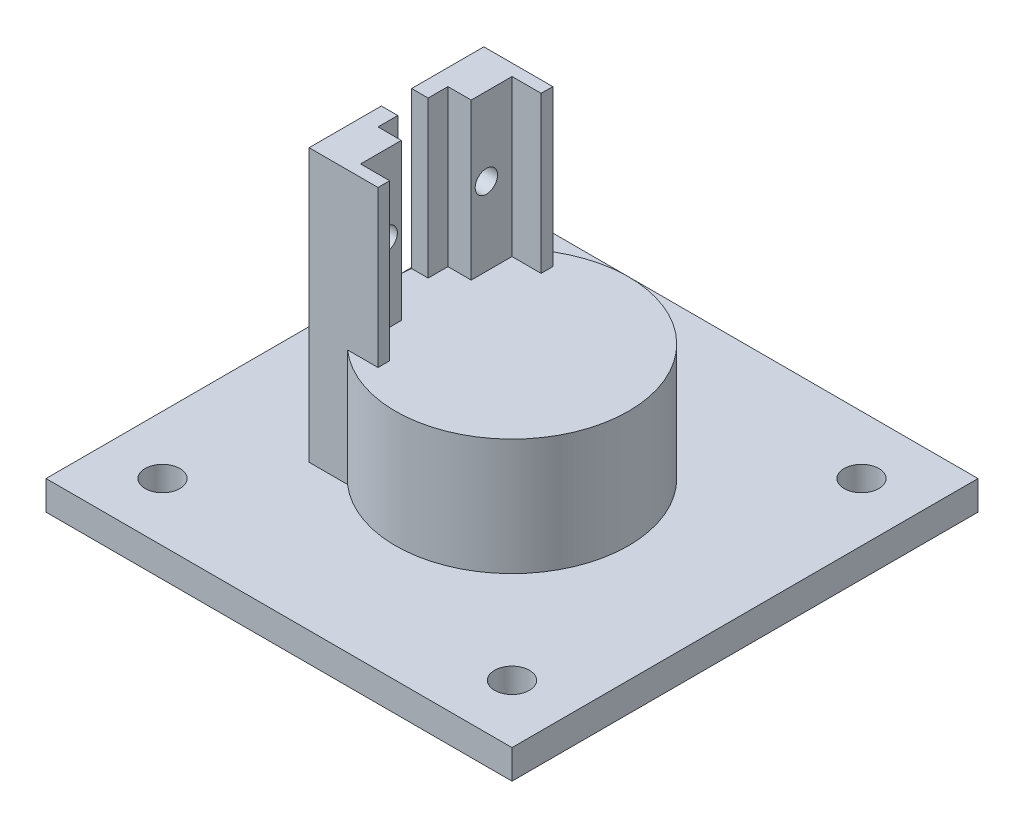
ISO-10303-21;
HEADER;
FILE_DESCRIPTION(('STEP AP214'),'2;1');
FILE_NAME('part.step','',(''),(''),'','','');
FILE_SCHEMA(('AUTOMOTIVE_DESIGN { 1 0 10303 214 1 1 1 1 }'));
ENDSEC;
DATA;
#1=APPLICATION_CONTEXT('core data for automotive mechanical design processes');
#2=APPLICATION_PROTOCOL_DEFINITION('international standard','automotive_design',2000,#1);
#3=PRODUCT_CONTEXT('',#1,'mechanical');
#4=PRODUCT('Part','Part','',(#3));
#5=PRODUCT_RELATED_PRODUCT_CATEGORY('part','',(#4));
#6=PRODUCT_DEFINITION_FORMATION('','',#4);
#7=PRODUCT_DEFINITION_CONTEXT('part definition',#1,'design');
#8=PRODUCT_DEFINITION('design','',#6,#7);
#9=PRODUCT_DEFINITION_SHAPE('','',#8);
#10=(LENGTH_UNIT() NAMED_UNIT(*) SI_UNIT(.MILLI.,.METRE.));
#11=(NAMED_UNIT(*) PLANE_ANGLE_UNIT() SI_UNIT($,.RADIAN.));
#12=(NAMED_UNIT(*) SI_UNIT($,.STERADIAN.) SOLID_ANGLE_UNIT());
#13=UNCERTAINTY_MEASURE_WITH_UNIT(LENGTH_MEASURE(1.E-05),#10,'distance_accuracy_value','');
#14=(GEOMETRIC_REPRESENTATION_CONTEXT(3) GLOBAL_UNCERTAINTY_ASSIGNED_CONTEXT((#13)) GLOBAL_UNIT_ASSIGNED_CONTEXT((#10,
#11,#12)) REPRESENTATION_CONTEXT('',''));
#15=CARTESIAN_POINT('',(0.,0.,0.));
#16=DIRECTION('',(0.,0.,1.));
#17=DIRECTION('',(1.,0.,0.));
#18=AXIS2_PLACEMENT_3D('',#15,#16,#17);
#19=CARTESIAN_POINT('',(0.,12.7,0.));
#20=DIRECTION('',(0.,-1.,0.));
#21=DIRECTION('',(0.,0.,-1.));
#22=AXIS2_PLACEMENT_3D('',#19,#20,#21);
#23=CYLINDRICAL_SURFACE('',#22,12.7);
#24=CARTESIAN_POINT('',(0.,12.7,0.));
#25=DIRECTION('',(0.,1.,0.));
#26=DIRECTION('',(0.,0.,1.));
#27=AXIS2_PLACEMENT_3D('',#24,#25,#26);
#28=CIRCLE('',#27,12.7);
#29=CARTESIAN_POINT('',(-8.40026041263007,12.7,9.525));
#30=VERTEX_POINT('',#29);
#31=CARTESIAN_POINT('',(-8.40026041263008,12.7,-9.525));
#32=VERTEX_POINT('',#31);
#33=EDGE_CURVE('E11',#30,#32,#28,.T.);
#34=ORIENTED_EDGE('',*,*,#33,.F.);
#35=DIRECTION('',(0.,1.,0.));
#36=VECTOR('',#35,1.);
#37=CARTESIAN_POINT('',(-8.40026041263007,-8.92034001156489,9.525));
#38=LINE('',#37,#36);
#39=CARTESIAN_POINT('',(-8.40026041263007,0.,9.525));
#40=VERTEX_POINT('',#39);
#41=EDGE_CURVE('E236',#40,#30,#38,.T.);
#42=ORIENTED_EDGE('',*,*,#41,.F.);
#43=CARTESIAN_POINT('',(0.,0.,0.));
#44=DIRECTION('',(0.,1.,0.));
#45=DIRECTION('',(0.,0.,1.));
#46=AXIS2_PLACEMENT_3D('',#43,#44,#45);
#47=CIRCLE('',#46,12.7);
#48=CARTESIAN_POINT('',(-8.40026041263008,0.,-9.525));
#49=VERTEX_POINT('',#48);
#50=EDGE_CURVE('E60',#40,#49,#47,.T.);
#51=ORIENTED_EDGE('',*,*,#50,.T.);
#52=DIRECTION('',(0.,1.,0.));
#53=VECTOR('',#52,1.);
#54=CARTESIAN_POINT('',(-8.40026041263007,-8.92034001156489,-9.525));
#55=LINE('',#54,#53);
#56=EDGE_CURVE('E260',#49,#32,#55,.T.);
#57=ORIENTED_EDGE('',*,*,#56,.T.);
#58=EDGE_LOOP('',(#34,#42,#51,#57));
#59=FACE_BOUND('',#58,.T.);
#60=ADVANCED_FACE('F35',(#59),#23,.T.);
#61=CARTESIAN_POINT('',(-12.5922277218926,0.,-1.651));
#62=VERTEX_POINT('',#61);
#63=CARTESIAN_POINT('',(-12.5922277218926,0.,1.651));
#64=VERTEX_POINT('',#63);
#65=EDGE_CURVE('E44',#62,#64,#47,.T.);
#66=ORIENTED_EDGE('',*,*,#65,.T.);
#67=DIRECTION('',(0.,1.,0.));
#68=VECTOR('',#67,1.);
#69=CARTESIAN_POINT('',(-12.5922277218926,-8.92034001156489,1.651));
#70=LINE('',#69,#68);
#71=CARTESIAN_POINT('',(-12.5922277218926,12.7,1.651));
#72=VERTEX_POINT('',#71);
#73=EDGE_CURVE('E240',#64,#72,#70,.T.);
#74=ORIENTED_EDGE('',*,*,#73,.T.);
#75=CARTESIAN_POINT('',(0.,12.7,0.));
#76=DIRECTION('',(0.,1.,0.));
#77=DIRECTION('',(0.,0.,1.));
#78=AXIS2_PLACEMENT_3D('',#75,#76,#77);
#79=CIRCLE('',#78,12.7);
#80=CARTESIAN_POINT('',(-12.5922277218926,12.7,-1.651));
#81=VERTEX_POINT('',#80);
#82=EDGE_CURVE('E274',#72,#81,#79,.F.);
#83=ORIENTED_EDGE('',*,*,#82,.T.);
#84=DIRECTION('',(0.,1.,0.));
#85=VECTOR('',#84,1.);
#86=CARTESIAN_POINT('',(-12.5922277218926,-8.92034001156489,-1.65100000000001));
#87=LINE('',#86,#85);
#88=EDGE_CURVE('E52',#62,#81,#87,.T.);
#89=ORIENTED_EDGE('',*,*,#88,.F.);
#90=EDGE_LOOP('',(#66,#74,#83,#89));
#91=FACE_BOUND('',#90,.T.);
#92=ADVANCED_FACE('F37',(#91),#23,.T.);
#93=CARTESIAN_POINT('',(-8.25499999999993,29.7,0.));
#94=DIRECTION('',(1.,0.,0.));
#95=DIRECTION('',(0.,0.,-1.));
#96=AXIS2_PLACEMENT_3D('',#93,#94,#95);
#97=PLANE('',#96);
#98=CARTESIAN_POINT('',(-8.25499999999993,21.2,5.46));
#99=DIRECTION('',(1.,0.,0.));
#100=DIRECTION('',(0.,0.,-1.));
#101=AXIS2_PLACEMENT_3D('',#98,#99,#100);
#102=CIRCLE('',#101,1.2192);
#103=CARTESIAN_POINT('',(-8.25499999999993,21.2,4.2408));
#104=VERTEX_POINT('',#103);
#105=EDGE_CURVE('E219',#104,#104,#102,.T.);
#106=ORIENTED_EDGE('',*,*,#105,.F.);
#107=EDGE_LOOP('',(#106));
#108=FACE_BOUND('',#107,.T.);
#109=DIRECTION('',(0.,0.,1.));
#110=VECTOR('',#109,1.);
#111=CARTESIAN_POINT('',(-8.25499999999993,12.7,0.));
#112=LINE('',#111,#110);
#113=CARTESIAN_POINT('',(-8.25499999999993,12.7,3.81));
#114=VERTEX_POINT('',#113);
#115=CARTESIAN_POINT('',(-8.25499999999993,12.7,8.255));
#116=VERTEX_POINT('',#115);
#117=EDGE_CURVE('E453',#114,#116,#112,.T.);
#118=ORIENTED_EDGE('',*,*,#117,.F.);
#119=DIRECTION('',(0.,1.,0.));
#120=VECTOR('',#119,1.);
#121=CARTESIAN_POINT('',(-8.25499999999993,3.87829806669934,3.81));
#122=LINE('',#121,#120);
#123=CARTESIAN_POINT('',(-8.25499999999993,29.7,3.81));
#124=VERTEX_POINT('',#123);
#125=EDGE_CURVE('E308',#114,#124,#122,.T.);
#126=ORIENTED_EDGE('',*,*,#125,.T.);
#127=DIRECTION('',(0.,0.,1.));
#128=VECTOR('',#127,1.);
#129=CARTESIAN_POINT('',(-8.25499999999993,29.7,0.));
#130=LINE('',#129,#128);
#131=CARTESIAN_POINT('',(-8.25499999999993,29.7,8.255));
#132=VERTEX_POINT('',#131);
#133=EDGE_CURVE('E326',#124,#132,#130,.T.);
#134=ORIENTED_EDGE('',*,*,#133,.T.);
#135=DIRECTION('',(0.,-1.,0.));
#136=VECTOR('',#135,1.);
#137=CARTESIAN_POINT('',(-8.25499999999993,29.7,8.255));
#138=LINE('',#137,#136);
#139=EDGE_CURVE('E430',#132,#116,#138,.T.);
#140=ORIENTED_EDGE('',*,*,#139,.T.);
#141=EDGE_LOOP('',(#118,#126,#134,#140));
#142=FACE_BOUND('',#141,.T.);
#143=ADVANCED_FACE('F409',(#108,#142),#97,.T.);
#144=CARTESIAN_POINT('',(0.,29.7,0.));
#145=DIRECTION('',(0.,1.,0.));
#146=DIRECTION('',(0.,0.,1.));
#147=AXIS2_PLACEMENT_3D('',#144,#145,#146);
#148=PLANE('',#147);
#149=DIRECTION('',(0.,0.,1.));
#150=VECTOR('',#149,1.);
#151=CARTESIAN_POINT('',(-10.795,29.7,0.));
#152=LINE('',#151,#150);
#153=CARTESIAN_POINT('',(-10.795,29.7,1.651));
#154=VERTEX_POINT('',#153);
#155=CARTESIAN_POINT('',(-10.795,29.7,3.81));
#156=VERTEX_POINT('',#155);
#157=EDGE_CURVE('E282',#154,#156,#152,.T.);
#158=ORIENTED_EDGE('',*,*,#157,.F.);
#159=DIRECTION('',(-1.,0.,0.));
#160=VECTOR('',#159,1.);
#161=CARTESIAN_POINT('',(0.,29.7,1.651));
#162=LINE('',#161,#160);
#163=CARTESIAN_POINT('',(-12.5922277218926,29.7,1.651));
#164=VERTEX_POINT('',#163);
#165=EDGE_CURVE('E254',#154,#164,#162,.T.);
#166=ORIENTED_EDGE('',*,*,#165,.T.);
#167=DIRECTION('',(0.,0.,1.));
#168=VECTOR('',#167,1.);
#169=CARTESIAN_POINT('',(-12.5922277218926,29.7,0.));
#170=LINE('',#169,#168);
#171=CARTESIAN_POINT('',(-12.5922277218926,29.7,9.525));
#172=VERTEX_POINT('',#171);
#173=EDGE_CURVE('E237',#164,#172,#170,.T.);
#174=ORIENTED_EDGE('',*,*,#173,.T.);
#175=DIRECTION('',(-1.,0.,0.));
#176=VECTOR('',#175,1.);
#177=CARTESIAN_POINT('',(0.,29.7,9.525));
#178=LINE('',#177,#176);
#179=CARTESIAN_POINT('',(-5.08,29.7,9.525));
#180=VERTEX_POINT('',#179);
#181=EDGE_CURVE('E317',#180,#172,#178,.T.);
#182=ORIENTED_EDGE('',*,*,#181,.F.);
#183=DIRECTION('',(0.,0.,1.));
#184=VECTOR('',#183,1.);
#185=CARTESIAN_POINT('',(-5.08,29.7,0.));
#186=LINE('',#185,#184);
#187=CARTESIAN_POINT('',(-5.08,29.7,8.255));
#188=VERTEX_POINT('',#187);
#189=EDGE_CURVE('E319',#188,#180,#186,.T.);
#190=ORIENTED_EDGE('',*,*,#189,.F.);
#191=DIRECTION('',(1.,0.,0.));
#192=VECTOR('',#191,1.);
#193=CARTESIAN_POINT('',(0.,29.7,8.255));
#194=LINE('',#193,#192);
#195=EDGE_CURVE('E323',#132,#188,#194,.T.);
#196=ORIENTED_EDGE('',*,*,#195,.F.);
#197=ORIENTED_EDGE('',*,*,#133,.F.);
#198=DIRECTION('',(-1.,0.,0.));
#199=VECTOR('',#198,1.);
#200=CARTESIAN_POINT('',(0.,29.7,3.81));
#201=LINE('',#200,#199);
#202=EDGE_CURVE('E285',#124,#156,#201,.T.);
#203=ORIENTED_EDGE('',*,*,#202,.T.);
#204=EDGE_LOOP('',(#158,#166,#174,#182,#190,#196,#197,#203));
#205=FACE_BOUND('',#204,.T.);
#206=ADVANCED_FACE('F501',(#205),#148,.T.);
#207=CARTESIAN_POINT('',(0.,12.7,0.));
#208=DIRECTION('',(0.,1.,0.));
#209=DIRECTION('',(0.,0.,1.));
#210=AXIS2_PLACEMENT_3D('',#207,#208,#209);
#211=PLANE('',#210);
#212=DIRECTION('',(0.,0.,1.));
#213=VECTOR('',#212,1.);
#214=CARTESIAN_POINT('',(-5.08,12.7,0.));
#215=LINE('',#214,#213);
#216=CARTESIAN_POINT('',(-5.08,12.7,8.255));
#217=VERTEX_POINT('',#216);
#218=CARTESIAN_POINT('',(-5.08,12.7,9.525));
#219=VERTEX_POINT('',#218);
#220=EDGE_CURVE('E342',#217,#219,#215,.T.);
#221=ORIENTED_EDGE('',*,*,#220,.T.);
#222=DIRECTION('',(-1.,0.,0.));
#223=VECTOR('',#222,1.);
#224=CARTESIAN_POINT('',(0.,12.7,9.525));
#225=LINE('',#224,#223);
#226=EDGE_CURVE('E316',#219,#30,#225,.T.);
#227=ORIENTED_EDGE('',*,*,#226,.T.);
#228=ORIENTED_EDGE('',*,*,#33,.T.);
#229=DIRECTION('',(1.,0.,0.));
#230=VECTOR('',#229,1.);
#231=CARTESIAN_POINT('',(0.,12.7,-9.525));
#232=LINE('',#231,#230);
#233=CARTESIAN_POINT('',(-5.08,12.7,-9.525));
#234=VERTEX_POINT('',#233);
#235=EDGE_CURVE('E320',#32,#234,#232,.T.);
#236=ORIENTED_EDGE('',*,*,#235,.T.);
#237=DIRECTION('',(0.,0.,1.));
#238=VECTOR('',#237,1.);
#239=CARTESIAN_POINT('',(-5.08,12.7,0.));
#240=LINE('',#239,#238);
#241=CARTESIAN_POINT('',(-5.08,12.7,-8.255));
#242=VERTEX_POINT('',#241);
#243=EDGE_CURVE('E435',#234,#242,#240,.T.);
#244=ORIENTED_EDGE('',*,*,#243,.T.);
#245=DIRECTION('',(-1.,0.,0.));
#246=VECTOR('',#245,1.);
#247=CARTESIAN_POINT('',(0.,12.7,-8.255));
#248=LINE('',#247,#246);
#249=CARTESIAN_POINT('',(-8.25499999999994,12.7,-8.255));
#250=VERTEX_POINT('',#249);
#251=EDGE_CURVE('E436',#242,#250,#248,.T.);
#252=ORIENTED_EDGE('',*,*,#251,.T.);
#253=CARTESIAN_POINT('',(-8.25499999999993,12.7,-3.81));
#254=VERTEX_POINT('',#253);
#255=EDGE_CURVE('E440',#250,#254,#112,.T.);
#256=ORIENTED_EDGE('',*,*,#255,.T.);
#257=DIRECTION('',(1.,0.,0.));
#258=VECTOR('',#257,1.);
#259=CARTESIAN_POINT('',(0.,12.7,-3.81));
#260=LINE('',#259,#258);
#261=CARTESIAN_POINT('',(-10.795,12.7,-3.81));
#262=VERTEX_POINT('',#261);
#263=EDGE_CURVE('E267',#262,#254,#260,.T.);
#264=ORIENTED_EDGE('',*,*,#263,.F.);
#265=DIRECTION('',(0.,0.,-1.));
#266=VECTOR('',#265,1.);
#267=CARTESIAN_POINT('',(-10.795,12.7,0.));
#268=LINE('',#267,#266);
#269=CARTESIAN_POINT('',(-10.795,12.7,-1.651));
#270=VERTEX_POINT('',#269);
#271=EDGE_CURVE('E270',#270,#262,#268,.T.);
#272=ORIENTED_EDGE('',*,*,#271,.F.);
#273=DIRECTION('',(1.,0.,0.));
#274=VECTOR('',#273,1.);
#275=CARTESIAN_POINT('',(0.,12.7,-1.651));
#276=LINE('',#275,#274);
#277=EDGE_CURVE('E272',#81,#270,#276,.T.);
#278=ORIENTED_EDGE('',*,*,#277,.F.);
#279=ORIENTED_EDGE('',*,*,#82,.F.);
#280=DIRECTION('',(1.,0.,0.));
#281=VECTOR('',#280,1.);
#282=CARTESIAN_POINT('',(0.,12.7,1.651));
#283=LINE('',#282,#281);
#284=CARTESIAN_POINT('',(-10.795,12.7,1.651));
#285=VERTEX_POINT('',#284);
#286=EDGE_CURVE('E276',#72,#285,#283,.T.);
#287=ORIENTED_EDGE('',*,*,#286,.T.);
#288=DIRECTION('',(0.,0.,-1.));
#289=VECTOR('',#288,1.);
#290=CARTESIAN_POINT('',(-10.795,12.7,0.));
#291=LINE('',#290,#289);
#292=CARTESIAN_POINT('',(-10.795,12.7,3.81));
#293=VERTEX_POINT('',#292);
#294=EDGE_CURVE('E279',#293,#285,#291,.T.);
#295=ORIENTED_EDGE('',*,*,#294,.F.);
#296=DIRECTION('',(1.,0.,0.));
#297=VECTOR('',#296,1.);
#298=CARTESIAN_POINT('',(0.,12.7,3.81));
#299=LINE('',#298,#297);
#300=EDGE_CURVE('E265',#293,#114,#299,.T.);
#301=ORIENTED_EDGE('',*,*,#300,.T.);
#302=ORIENTED_EDGE('',*,*,#117,.T.);
#303=DIRECTION('',(1.,0.,0.));
#304=VECTOR('',#303,1.);
#305=CARTESIAN_POINT('',(0.,12.7,8.255));
#306=LINE('',#305,#304);
#307=EDGE_CURVE('E457',#116,#217,#306,.T.);
#308=ORIENTED_EDGE('',*,*,#307,.T.);
#309=EDGE_LOOP('',(#221,#227,#228,#236,#244,#252,#256,#264,#272,#278,#279,#287,#295,#301,#302,#308));
#310=FACE_BOUND('',#309,.T.);
#311=ADVANCED_FACE('F415',(#310),#211,.T.);
#312=CARTESIAN_POINT('',(0.,29.7,9.525));
#313=DIRECTION('',(0.,0.,1.));
#314=DIRECTION('',(1.,0.,0.));
#315=AXIS2_PLACEMENT_3D('',#312,#313,#314);
#316=PLANE('',#315);
#317=ORIENTED_EDGE('',*,*,#226,.F.);
#318=DIRECTION('',(0.,-1.,0.));
#319=VECTOR('',#318,1.);
#320=CARTESIAN_POINT('',(-5.08,29.7,9.525));
#321=LINE('',#320,#319);
#322=EDGE_CURVE('E422',#180,#219,#321,.T.);
#323=ORIENTED_EDGE('',*,*,#322,.F.);
#324=ORIENTED_EDGE('',*,*,#181,.T.);
#325=DIRECTION('',(0.,1.,0.));
#326=VECTOR('',#325,1.);
#327=CARTESIAN_POINT('',(-12.5922277218926,-8.92034001156489,9.525));
#328=LINE('',#327,#326);
#329=CARTESIAN_POINT('',(-12.5922277218926,0.,9.525));
#330=VERTEX_POINT('',#329);
#331=EDGE_CURVE('E243',#330,#172,#328,.T.);
#332=ORIENTED_EDGE('',*,*,#331,.F.);
#333=DIRECTION('',(-1.,0.,0.));
#334=VECTOR('',#333,1.);
#335=CARTESIAN_POINT('',(0.,0.,9.525));
#336=LINE('',#335,#334);
#337=EDGE_CURVE('E232',#40,#330,#336,.T.);
#338=ORIENTED_EDGE('',*,*,#337,.F.);
#339=ORIENTED_EDGE('',*,*,#41,.T.);
#340=EDGE_LOOP('',(#317,#323,#324,#332,#338,#339));
#341=FACE_BOUND('',#340,.T.);
#342=ADVANCED_FACE('F421',(#341),#316,.T.);
#343=CARTESIAN_POINT('',(-5.08,29.7,0.));
#344=DIRECTION('',(1.,0.,0.));
#345=DIRECTION('',(0.,0.,-1.));
#346=AXIS2_PLACEMENT_3D('',#343,#344,#345);
#347=PLANE('',#346);
#348=ORIENTED_EDGE('',*,*,#220,.F.);
#349=DIRECTION('',(0.,-1.,0.));
#350=VECTOR('',#349,1.);
#351=CARTESIAN_POINT('',(-5.08,29.7,8.255));
#352=LINE('',#351,#350);
#353=EDGE_CURVE('E427',#188,#217,#352,.T.);
#354=ORIENTED_EDGE('',*,*,#353,.F.);
#355=ORIENTED_EDGE('',*,*,#189,.T.);
#356=ORIENTED_EDGE('',*,*,#322,.T.);
#357=EDGE_LOOP('',(#348,#354,#355,#356));
#358=FACE_BOUND('',#357,.T.);
#359=ADVANCED_FACE('F425',(#358),#347,.T.);
#360=CARTESIAN_POINT('',(0.,29.7,8.255));
#361=DIRECTION('',(0.,0.,-1.));
#362=DIRECTION('',(-1.,0.,0.));
#363=AXIS2_PLACEMENT_3D('',#360,#361,#362);
#364=PLANE('',#363);
#365=ORIENTED_EDGE('',*,*,#307,.F.);
#366=ORIENTED_EDGE('',*,*,#139,.F.);
#367=ORIENTED_EDGE('',*,*,#195,.T.);
#368=ORIENTED_EDGE('',*,*,#353,.T.);
#369=EDGE_LOOP('',(#365,#366,#367,#368));
#370=FACE_BOUND('',#369,.T.);
#371=ADVANCED_FACE('F458',(#370),#364,.T.);
#372=CARTESIAN_POINT('',(-8.25499999999993,21.2,-5.46));
#373=DIRECTION('',(1.,0.,0.));
#374=DIRECTION('',(0.,0.,-1.));
#375=AXIS2_PLACEMENT_3D('',#372,#373,#374);
#376=CIRCLE('',#375,1.2192);
#377=CARTESIAN_POINT('',(-8.25499999999993,21.2,-6.67919999999999));
#378=VERTEX_POINT('',#377);
#379=EDGE_CURVE('E228',#378,#378,#376,.T.);
#380=ORIENTED_EDGE('',*,*,#379,.F.);
#381=EDGE_LOOP('',(#380));
#382=FACE_BOUND('',#381,.T.);
#383=DIRECTION('',(0.,1.,0.));
#384=VECTOR('',#383,1.);
#385=CARTESIAN_POINT('',(-8.25499999999993,3.87829806669934,-3.81));
#386=LINE('',#385,#384);
#387=CARTESIAN_POINT('',(-8.25499999999993,29.7,-3.81));
#388=VERTEX_POINT('',#387);
#389=EDGE_CURVE('E306',#254,#388,#386,.T.);
#390=ORIENTED_EDGE('',*,*,#389,.F.);
#391=ORIENTED_EDGE('',*,*,#255,.F.);
#392=DIRECTION('',(0.,-1.,0.));
#393=VECTOR('',#392,1.);
#394=CARTESIAN_POINT('',(-8.25499999999994,29.7,-8.255));
#395=LINE('',#394,#393);
#396=CARTESIAN_POINT('',(-8.25499999999994,29.7,-8.255));
#397=VERTEX_POINT('',#396);
#398=EDGE_CURVE('E447',#397,#250,#395,.T.);
#399=ORIENTED_EDGE('',*,*,#398,.F.);
#400=EDGE_CURVE('E327',#397,#388,#130,.T.);
#401=ORIENTED_EDGE('',*,*,#400,.T.);
#402=EDGE_LOOP('',(#390,#391,#399,#401));
#403=FACE_BOUND('',#402,.T.);
#404=ADVANCED_FACE('F467',(#382,#403),#97,.T.);
#405=CARTESIAN_POINT('',(0.,29.7,-8.255));
#406=DIRECTION('',(0.,0.,1.));
#407=DIRECTION('',(1.,0.,0.));
#408=AXIS2_PLACEMENT_3D('',#405,#406,#407);
#409=PLANE('',#408);
#410=ORIENTED_EDGE('',*,*,#251,.F.);
#411=DIRECTION('',(0.,-1.,0.));
#412=VECTOR('',#411,1.);
#413=CARTESIAN_POINT('',(-5.08,29.7,-8.255));
#414=LINE('',#413,#412);
#415=CARTESIAN_POINT('',(-5.08,29.7,-8.255));
#416=VERTEX_POINT('',#415);
#417=EDGE_CURVE('E445',#416,#242,#414,.T.);
#418=ORIENTED_EDGE('',*,*,#417,.F.);
#419=DIRECTION('',(-1.,0.,0.));
#420=VECTOR('',#419,1.);
#421=CARTESIAN_POINT('',(0.,29.7,-8.255));
#422=LINE('',#421,#420);
#423=EDGE_CURVE('E330',#416,#397,#422,.T.);
#424=ORIENTED_EDGE('',*,*,#423,.T.);
#425=ORIENTED_EDGE('',*,*,#398,.T.);
#426=EDGE_LOOP('',(#410,#418,#424,#425));
#427=FACE_BOUND('',#426,.T.);
#428=ADVANCED_FACE('F533',(#427),#409,.T.);
#429=CARTESIAN_POINT('',(-5.08,29.7,0.));
#430=DIRECTION('',(1.,0.,0.));
#431=DIRECTION('',(0.,0.,-1.));
#432=AXIS2_PLACEMENT_3D('',#429,#430,#431);
#433=PLANE('',#432);
#434=ORIENTED_EDGE('',*,*,#243,.F.);
#435=DIRECTION('',(0.,-1.,0.));
#436=VECTOR('',#435,1.);
#437=CARTESIAN_POINT('',(-5.08,29.7,-9.525));
#438=LINE('',#437,#436);
#439=CARTESIAN_POINT('',(-5.08,29.7,-9.525));
#440=VERTEX_POINT('',#439);
#441=EDGE_CURVE('E339',#440,#234,#438,.T.);
#442=ORIENTED_EDGE('',*,*,#441,.F.);
#443=DIRECTION('',(0.,0.,1.));
#444=VECTOR('',#443,1.);
#445=CARTESIAN_POINT('',(-5.08,29.7,0.));
#446=LINE('',#445,#444);
#447=EDGE_CURVE('E333',#440,#416,#446,.T.);
#448=ORIENTED_EDGE('',*,*,#447,.T.);
#449=ORIENTED_EDGE('',*,*,#417,.T.);
#450=EDGE_LOOP('',(#434,#442,#448,#449));
#451=FACE_BOUND('',#450,.T.);
#452=ADVANCED_FACE('F529',(#451),#433,.T.);
#453=CARTESIAN_POINT('',(0.,29.7,-9.525));
#454=DIRECTION('',(0.,0.,-1.));
#455=DIRECTION('',(-1.,0.,0.));
#456=AXIS2_PLACEMENT_3D('',#453,#454,#455);
#457=PLANE('',#456);
#458=ORIENTED_EDGE('',*,*,#235,.F.);
#459=ORIENTED_EDGE('',*,*,#56,.F.);
#460=DIRECTION('',(-1.,0.,0.));
#461=VECTOR('',#460,1.);
#462=CARTESIAN_POINT('',(0.,0.,-9.525));
#463=LINE('',#462,#461);
#464=CARTESIAN_POINT('',(-12.5922277218926,0.,-9.525));
#465=VERTEX_POINT('',#464);
#466=EDGE_CURVE('E248',#49,#465,#463,.T.);
#467=ORIENTED_EDGE('',*,*,#466,.T.);
#468=DIRECTION('',(0.,1.,0.));
#469=VECTOR('',#468,1.);
#470=CARTESIAN_POINT('',(-12.5922277218926,-8.92034001156489,-9.525));
#471=LINE('',#470,#469);
#472=CARTESIAN_POINT('',(-12.5922277218926,29.7,-9.525));
#473=VERTEX_POINT('',#472);
#474=EDGE_CURVE('E252',#465,#473,#471,.T.);
#475=ORIENTED_EDGE('',*,*,#474,.T.);
#476=DIRECTION('',(1.,0.,0.));
#477=VECTOR('',#476,1.);
#478=CARTESIAN_POINT('',(0.,29.7,-9.525));
#479=LINE('',#478,#477);
#480=EDGE_CURVE('E336',#473,#440,#479,.T.);
#481=ORIENTED_EDGE('',*,*,#480,.T.);
#482=ORIENTED_EDGE('',*,*,#441,.T.);
#483=EDGE_LOOP('',(#458,#459,#467,#475,#481,#482));
#484=FACE_BOUND('',#483,.T.);
#485=ADVANCED_FACE('F526',(#484),#457,.T.);
#486=DIRECTION('',(-1.,0.,0.));
#487=VECTOR('',#486,1.);
#488=CARTESIAN_POINT('',(0.,29.7,-1.651));
#489=LINE('',#488,#487);
#490=CARTESIAN_POINT('',(-10.795,29.7,-1.651));
#491=VERTEX_POINT('',#490);
#492=CARTESIAN_POINT('',(-12.5922277218926,29.7,-1.65100000000001));
#493=VERTEX_POINT('',#492);
#494=EDGE_CURVE('E294',#491,#493,#489,.T.);
#495=ORIENTED_EDGE('',*,*,#494,.F.);
#496=DIRECTION('',(0.,0.,1.));
#497=VECTOR('',#496,1.);
#498=CARTESIAN_POINT('',(-10.795,29.7,0.));
#499=LINE('',#498,#497);
#500=CARTESIAN_POINT('',(-10.795,29.7,-3.81));
#501=VERTEX_POINT('',#500);
#502=EDGE_CURVE('E291',#501,#491,#499,.T.);
#503=ORIENTED_EDGE('',*,*,#502,.F.);
#504=DIRECTION('',(-1.,0.,0.));
#505=VECTOR('',#504,1.);
#506=CARTESIAN_POINT('',(0.,29.7,-3.81));
#507=LINE('',#506,#505);
#508=EDGE_CURVE('E288',#388,#501,#507,.T.);
#509=ORIENTED_EDGE('',*,*,#508,.F.);
#510=ORIENTED_EDGE('',*,*,#400,.F.);
#511=ORIENTED_EDGE('',*,*,#423,.F.);
#512=ORIENTED_EDGE('',*,*,#447,.F.);
#513=ORIENTED_EDGE('',*,*,#480,.F.);
#514=DIRECTION('',(0.,0.,-1.));
#515=VECTOR('',#514,1.);
#516=CARTESIAN_POINT('',(-12.5922277218926,29.7,0.));
#517=LINE('',#516,#515);
#518=EDGE_CURVE('E255',#493,#473,#517,.T.);
#519=ORIENTED_EDGE('',*,*,#518,.F.);
#520=EDGE_LOOP('',(#495,#503,#509,#510,#511,#512,#513,#519));
#521=FACE_BOUND('',#520,.T.);
#522=ADVANCED_FACE('F475',(#521),#148,.T.);
#523=CARTESIAN_POINT('',(0.,3.87829806669934,1.651));
#524=DIRECTION('',(0.,0.,-1.));
#525=DIRECTION('',(-1.,0.,0.));
#526=AXIS2_PLACEMENT_3D('',#523,#524,#525);
#527=PLANE('',#526);
#528=DIRECTION('',(0.,1.,0.));
#529=VECTOR('',#528,1.);
#530=CARTESIAN_POINT('',(-12.5922277218926,3.87829806669934,1.651));
#531=LINE('',#530,#529);
#532=EDGE_CURVE('E268',#72,#164,#531,.T.);
#533=ORIENTED_EDGE('',*,*,#532,.T.);
#534=ORIENTED_EDGE('',*,*,#165,.F.);
#535=DIRECTION('',(0.,1.,0.));
#536=VECTOR('',#535,1.);
#537=CARTESIAN_POINT('',(-10.795,3.87829806669934,1.651));
#538=LINE('',#537,#536);
#539=EDGE_CURVE('E296',#285,#154,#538,.T.);
#540=ORIENTED_EDGE('',*,*,#539,.F.);
#541=ORIENTED_EDGE('',*,*,#286,.F.);
#542=EDGE_LOOP('',(#533,#534,#540,#541));
#543=FACE_BOUND('',#542,.T.);
#544=ADVANCED_FACE('F504',(#543),#527,.T.);
#545=CARTESIAN_POINT('',(0.,3.87829806669934,-1.651));
#546=DIRECTION('',(0.,0.,-1.));
#547=DIRECTION('',(-1.,0.,0.));
#548=AXIS2_PLACEMENT_3D('',#545,#546,#547);
#549=PLANE('',#548);
#550=ORIENTED_EDGE('',*,*,#277,.T.);
#551=DIRECTION('',(0.,1.,0.));
#552=VECTOR('',#551,1.);
#553=CARTESIAN_POINT('',(-10.795,3.87829806669934,-1.651));
#554=LINE('',#553,#552);
#555=EDGE_CURVE('E302',#270,#491,#554,.T.);
#556=ORIENTED_EDGE('',*,*,#555,.T.);
#557=ORIENTED_EDGE('',*,*,#494,.T.);
#558=DIRECTION('',(0.,1.,0.));
#559=VECTOR('',#558,1.);
#560=CARTESIAN_POINT('',(-12.5922277218926,3.87829806669934,-1.651));
#561=LINE('',#560,#559);
#562=EDGE_CURVE('E299',#81,#493,#561,.T.);
#563=ORIENTED_EDGE('',*,*,#562,.F.);
#564=EDGE_LOOP('',(#550,#556,#557,#563));
#565=FACE_BOUND('',#564,.T.);
#566=ADVANCED_FACE('F484',(#565),#549,.F.);
#567=CARTESIAN_POINT('',(-10.795,3.87829806669934,0.));
#568=DIRECTION('',(-1.,0.,0.));
#569=DIRECTION('',(0.,0.,1.));
#570=AXIS2_PLACEMENT_3D('',#567,#568,#569);
#571=PLANE('',#570);
#572=ORIENTED_EDGE('',*,*,#271,.T.);
#573=DIRECTION('',(0.,1.,0.));
#574=VECTOR('',#573,1.);
#575=CARTESIAN_POINT('',(-10.795,3.87829806669934,-3.81));
#576=LINE('',#575,#574);
#577=EDGE_CURVE('E304',#262,#501,#576,.T.);
#578=ORIENTED_EDGE('',*,*,#577,.T.);
#579=ORIENTED_EDGE('',*,*,#502,.T.);
#580=ORIENTED_EDGE('',*,*,#555,.F.);
#581=EDGE_LOOP('',(#572,#578,#579,#580));
#582=FACE_BOUND('',#581,.T.);
#583=ADVANCED_FACE('F480',(#582),#571,.F.);
#584=CARTESIAN_POINT('',(0.,3.87829806669934,-3.81));
#585=DIRECTION('',(0.,0.,-1.));
#586=DIRECTION('',(-1.,0.,0.));
#587=AXIS2_PLACEMENT_3D('',#584,#585,#586);
#588=PLANE('',#587);
#589=ORIENTED_EDGE('',*,*,#263,.T.);
#590=ORIENTED_EDGE('',*,*,#389,.T.);
#591=ORIENTED_EDGE('',*,*,#508,.T.);
#592=ORIENTED_EDGE('',*,*,#577,.F.);
#593=EDGE_LOOP('',(#589,#590,#591,#592));
#594=FACE_BOUND('',#593,.T.);
#595=ADVANCED_FACE('F471',(#594),#588,.F.);
#596=CARTESIAN_POINT('',(0.,3.87829806669934,3.81));
#597=DIRECTION('',(0.,0.,-1.));
#598=DIRECTION('',(-1.,0.,0.));
#599=AXIS2_PLACEMENT_3D('',#596,#597,#598);
#600=PLANE('',#599);
#601=DIRECTION('',(0.,1.,0.));
#602=VECTOR('',#601,1.);
#603=CARTESIAN_POINT('',(-10.795,3.87829806669934,3.81));
#604=LINE('',#603,#602);
#605=EDGE_CURVE('E311',#293,#156,#604,.T.);
#606=ORIENTED_EDGE('',*,*,#605,.T.);
#607=ORIENTED_EDGE('',*,*,#202,.F.);
#608=ORIENTED_EDGE('',*,*,#125,.F.);
#609=ORIENTED_EDGE('',*,*,#300,.F.);
#610=EDGE_LOOP('',(#606,#607,#608,#609));
#611=FACE_BOUND('',#610,.T.);
#612=ADVANCED_FACE('F511',(#611),#600,.T.);
#613=CARTESIAN_POINT('',(-10.795,3.87829806669934,0.));
#614=DIRECTION('',(-1.,0.,0.));
#615=DIRECTION('',(0.,0.,1.));
#616=AXIS2_PLACEMENT_3D('',#613,#614,#615);
#617=PLANE('',#616);
#618=ORIENTED_EDGE('',*,*,#294,.T.);
#619=ORIENTED_EDGE('',*,*,#539,.T.);
#620=ORIENTED_EDGE('',*,*,#157,.T.);
#621=ORIENTED_EDGE('',*,*,#605,.F.);
#622=EDGE_LOOP('',(#618,#619,#620,#621));
#623=FACE_BOUND('',#622,.T.);
#624=ADVANCED_FACE('F506',(#623),#617,.F.);
#625=CARTESIAN_POINT('',(-12.5922277218926,-8.92034001156489,0.));
#626=DIRECTION('',(1.,0.,0.));
#627=DIRECTION('',(0.,0.,-1.));
#628=AXIS2_PLACEMENT_3D('',#625,#626,#627);
#629=PLANE('',#628);
#630=CARTESIAN_POINT('',(-12.5922277218926,21.2,-5.46));
#631=DIRECTION('',(1.,0.,0.));
#632=DIRECTION('',(0.,0.,-1.));
#633=AXIS2_PLACEMENT_3D('',#630,#631,#632);
#634=CIRCLE('',#633,1.21919999999999);
#635=CARTESIAN_POINT('',(-12.5922277218926,21.2,-6.67919999999999));
#636=VERTEX_POINT('',#635);
#637=EDGE_CURVE('E231',#636,#636,#634,.T.);
#638=ORIENTED_EDGE('',*,*,#637,.T.);
#639=EDGE_LOOP('',(#638));
#640=FACE_BOUND('',#639,.T.);
#641=ORIENTED_EDGE('',*,*,#474,.F.);
#642=DIRECTION('',(0.,0.,1.));
#643=VECTOR('',#642,1.);
#644=CARTESIAN_POINT('',(-12.5922277218926,0.,0.));
#645=LINE('',#644,#643);
#646=EDGE_CURVE('E251',#465,#62,#645,.T.);
#647=ORIENTED_EDGE('',*,*,#646,.T.);
#648=ORIENTED_EDGE('',*,*,#88,.T.);
#649=ORIENTED_EDGE('',*,*,#562,.T.);
#650=ORIENTED_EDGE('',*,*,#518,.T.);
#651=EDGE_LOOP('',(#641,#647,#648,#649,#650));
#652=FACE_BOUND('',#651,.T.);
#653=ADVANCED_FACE('F489',(#640,#652),#629,.F.);
#654=CARTESIAN_POINT('',(-12.5922277218926,-8.92034001156489,0.));
#655=DIRECTION('',(-1.,0.,0.));
#656=DIRECTION('',(0.,0.,1.));
#657=AXIS2_PLACEMENT_3D('',#654,#655,#656);
#658=PLANE('',#657);
#659=CARTESIAN_POINT('',(-12.5922277218926,21.2,5.46));
#660=DIRECTION('',(-1.,0.,0.));
#661=DIRECTION('',(0.,0.,1.));
#662=AXIS2_PLACEMENT_3D('',#659,#660,#661);
#663=CIRCLE('',#662,1.21919999999999);
#664=CARTESIAN_POINT('',(-12.5922277218926,21.2,6.6792));
#665=VERTEX_POINT('',#664);
#666=EDGE_CURVE('E222',#665,#665,#663,.T.);
#667=ORIENTED_EDGE('',*,*,#666,.F.);
#668=EDGE_LOOP('',(#667));
#669=FACE_BOUND('',#668,.T.);
#670=DIRECTION('',(0.,0.,-1.));
#671=VECTOR('',#670,1.);
#672=CARTESIAN_POINT('',(-12.5922277218926,0.,0.));
#673=LINE('',#672,#671);
#674=EDGE_CURVE('E235',#330,#64,#673,.T.);
#675=ORIENTED_EDGE('',*,*,#674,.F.);
#676=ORIENTED_EDGE('',*,*,#331,.T.);
#677=ORIENTED_EDGE('',*,*,#173,.F.);
#678=ORIENTED_EDGE('',*,*,#532,.F.);
#679=ORIENTED_EDGE('',*,*,#73,.F.);
#680=EDGE_LOOP('',(#675,#676,#677,#678,#679));
#681=FACE_BOUND('',#680,.T.);
#682=ADVANCED_FACE('F497',(#669,#681),#658,.T.);
#683=CARTESIAN_POINT('',(-8.25499999999993,21.2,-5.46));
#684=DIRECTION('',(1.,0.,0.));
#685=DIRECTION('',(0.,0.,-1.));
#686=AXIS2_PLACEMENT_3D('',#683,#684,#685);
#687=CYLINDRICAL_SURFACE('',#686,1.21919999999999);
#688=ORIENTED_EDGE('',*,*,#379,.T.);
#689=EDGE_LOOP('',(#688));
#690=FACE_BOUND('',#689,.T.);
#691=ORIENTED_EDGE('',*,*,#637,.F.);
#692=EDGE_LOOP('',(#691));
#693=FACE_BOUND('',#692,.T.);
#694=ADVANCED_FACE('F560',(#690,#693),#687,.F.);
#695=CARTESIAN_POINT('',(-8.25499999999993,21.2,5.46));
#696=DIRECTION('',(1.,0.,0.));
#697=DIRECTION('',(0.,0.,-1.));
#698=AXIS2_PLACEMENT_3D('',#695,#696,#697);
#699=CYLINDRICAL_SURFACE('',#698,1.21919999999999);
#700=ORIENTED_EDGE('',*,*,#666,.T.);
#701=EDGE_LOOP('',(#700));
#702=FACE_BOUND('',#701,.T.);
#703=ORIENTED_EDGE('',*,*,#105,.T.);
#704=EDGE_LOOP('',(#703));
#705=FACE_BOUND('',#704,.T.);
#706=ADVANCED_FACE('F558',(#702,#705),#699,.F.);
#707=CARTESIAN_POINT('',(-25.4,-3.175,25.4));
#708=DIRECTION('',(1.,0.,0.));
#709=DIRECTION('',(0.,0.,-1.));
#710=AXIS2_PLACEMENT_3D('',#707,#708,#709);
#711=PLANE('',#710);
#712=DIRECTION('',(0.,0.,-1.));
#713=VECTOR('',#712,1.);
#714=CARTESIAN_POINT('',(-25.4,0.,25.4));
#715=LINE('',#714,#713);
#716=CARTESIAN_POINT('',(-25.4,0.,25.4));
#717=VERTEX_POINT('',#716);
#718=CARTESIAN_POINT('',(-25.4,0.,-25.4));
#719=VERTEX_POINT('',#718);
#720=EDGE_CURVE('E218',#717,#719,#715,.T.);
#721=ORIENTED_EDGE('',*,*,#720,.T.);
#722=DIRECTION('',(0.,1.,0.));
#723=VECTOR('',#722,1.);
#724=CARTESIAN_POINT('',(-25.4,-3.175,-25.4));
#725=LINE('',#724,#723);
#726=CARTESIAN_POINT('',(-25.4,-3.175,-25.4));
#727=VERTEX_POINT('',#726);
#728=EDGE_CURVE('E198',#727,#719,#725,.T.);
#729=ORIENTED_EDGE('',*,*,#728,.F.);
#730=DIRECTION('',(0.,0.,-1.));
#731=VECTOR('',#730,1.);
#732=CARTESIAN_POINT('',(-25.4,-3.175,25.4));
#733=LINE('',#732,#731);
#734=CARTESIAN_POINT('',(-25.4,-3.175,25.4));
#735=VERTEX_POINT('',#734);
#736=EDGE_CURVE('E205',#735,#727,#733,.T.);
#737=ORIENTED_EDGE('',*,*,#736,.F.);
#738=DIRECTION('',(0.,1.,0.));
#739=VECTOR('',#738,1.);
#740=CARTESIAN_POINT('',(-25.4,-3.175,25.4));
#741=LINE('',#740,#739);
#742=EDGE_CURVE('E380',#735,#717,#741,.T.);
#743=ORIENTED_EDGE('',*,*,#742,.T.);
#744=EDGE_LOOP('',(#721,#729,#737,#743));
#745=FACE_BOUND('',#744,.T.);
#746=ADVANCED_FACE('F216',(#745),#711,.F.);
#747=CARTESIAN_POINT('',(25.4,-3.175,-25.4));
#748=DIRECTION('',(0.,0.,1.));
#749=DIRECTION('',(1.,0.,0.));
#750=AXIS2_PLACEMENT_3D('',#747,#748,#749);
#751=PLANE('',#750);
#752=DIRECTION('',(1.,0.,0.));
#753=VECTOR('',#752,1.);
#754=CARTESIAN_POINT('',(25.4,0.,-25.4));
#755=LINE('',#754,#753);
#756=CARTESIAN_POINT('',(25.4,0.,-25.4));
#757=VERTEX_POINT('',#756);
#758=EDGE_CURVE('E382',#719,#757,#755,.T.);
#759=ORIENTED_EDGE('',*,*,#758,.T.);
#760=DIRECTION('',(0.,1.,0.));
#761=VECTOR('',#760,1.);
#762=CARTESIAN_POINT('',(25.4,-3.175,-25.4));
#763=LINE('',#762,#761);
#764=CARTESIAN_POINT('',(25.4,-3.175,-25.4));
#765=VERTEX_POINT('',#764);
#766=EDGE_CURVE('E201',#765,#757,#763,.T.);
#767=ORIENTED_EDGE('',*,*,#766,.F.);
#768=DIRECTION('',(1.,0.,0.));
#769=VECTOR('',#768,1.);
#770=CARTESIAN_POINT('',(25.4,-3.175,-25.4));
#771=LINE('',#770,#769);
#772=EDGE_CURVE('E194',#727,#765,#771,.T.);
#773=ORIENTED_EDGE('',*,*,#772,.F.);
#774=ORIENTED_EDGE('',*,*,#728,.T.);
#775=EDGE_LOOP('',(#759,#767,#773,#774));
#776=FACE_BOUND('',#775,.T.);
#777=ADVANCED_FACE('F196',(#776),#751,.F.);
#778=CARTESIAN_POINT('',(25.4,-3.175,25.4));
#779=DIRECTION('',(-1.,0.,0.));
#780=DIRECTION('',(0.,0.,1.));
#781=AXIS2_PLACEMENT_3D('',#778,#779,#780);
#782=PLANE('',#781);
#783=DIRECTION('',(0.,0.,1.));
#784=VECTOR('',#783,1.);
#785=CARTESIAN_POINT('',(25.4,0.,25.4));
#786=LINE('',#785,#784);
#787=CARTESIAN_POINT('',(25.4,0.,25.4));
#788=VERTEX_POINT('',#787);
#789=EDGE_CURVE('E384',#757,#788,#786,.T.);
#790=ORIENTED_EDGE('',*,*,#789,.T.);
#791=DIRECTION('',(0.,1.,0.));
#792=VECTOR('',#791,1.);
#793=CARTESIAN_POINT('',(25.4,-3.175,25.4));
#794=LINE('',#793,#792);
#795=CARTESIAN_POINT('',(25.4,-3.175,25.4));
#796=VERTEX_POINT('',#795);
#797=EDGE_CURVE('E224',#796,#788,#794,.T.);
#798=ORIENTED_EDGE('',*,*,#797,.F.);
#799=DIRECTION('',(0.,0.,1.));
#800=VECTOR('',#799,1.);
#801=CARTESIAN_POINT('',(25.4,-3.175,25.4));
#802=LINE('',#801,#800);
#803=EDGE_CURVE('E204',#765,#796,#802,.T.);
#804=ORIENTED_EDGE('',*,*,#803,.F.);
#805=ORIENTED_EDGE('',*,*,#766,.T.);
#806=EDGE_LOOP('',(#790,#798,#804,#805));
#807=FACE_BOUND('',#806,.T.);
#808=ADVANCED_FACE('F396',(#807),#782,.F.);
#809=CARTESIAN_POINT('',(25.4,-3.175,25.4));
#810=DIRECTION('',(0.,0.,-1.));
#811=DIRECTION('',(-1.,0.,0.));
#812=AXIS2_PLACEMENT_3D('',#809,#810,#811);
#813=PLANE('',#812);
#814=DIRECTION('',(-1.,0.,0.));
#815=VECTOR('',#814,1.);
#816=CARTESIAN_POINT('',(25.4,0.,25.4));
#817=LINE('',#816,#815);
#818=EDGE_CURVE('E214',#788,#717,#817,.T.);
#819=ORIENTED_EDGE('',*,*,#818,.T.);
#820=ORIENTED_EDGE('',*,*,#742,.F.);
#821=DIRECTION('',(-1.,0.,0.));
#822=VECTOR('',#821,1.);
#823=CARTESIAN_POINT('',(25.4,-3.175,25.4));
#824=LINE('',#823,#822);
#825=EDGE_CURVE('E210',#796,#735,#824,.T.);
#826=ORIENTED_EDGE('',*,*,#825,.F.);
#827=ORIENTED_EDGE('',*,*,#797,.T.);
#828=EDGE_LOOP('',(#819,#820,#826,#827));
#829=FACE_BOUND('',#828,.T.);
#830=ADVANCED_FACE('F391',(#829),#813,.F.);
#831=CARTESIAN_POINT('',(0.,-3.175,0.));
#832=DIRECTION('',(0.,1.,0.));
#833=DIRECTION('',(0.,0.,1.));
#834=AXIS2_PLACEMENT_3D('',#831,#832,#833);
#835=PLANE('',#834);
#836=CARTESIAN_POINT('',(-19.05,-3.175,19.05));
#837=DIRECTION('',(0.,-1.,0.));
#838=DIRECTION('',(0.,0.,-1.));
#839=AXIS2_PLACEMENT_3D('',#836,#837,#838);
#840=CIRCLE('',#839,1.89864999999999);
#841=CARTESIAN_POINT('',(-19.05,-3.175,17.15135));
#842=VERTEX_POINT('',#841);
#843=EDGE_CURVE('E373',#842,#842,#840,.T.);
#844=ORIENTED_EDGE('',*,*,#843,.F.);
#845=EDGE_LOOP('',(#844));
#846=FACE_BOUND('',#845,.T.);
#847=CARTESIAN_POINT('',(19.05,-3.175,19.05));
#848=DIRECTION('',(0.,-1.,0.));
#849=DIRECTION('',(0.,0.,-1.));
#850=AXIS2_PLACEMENT_3D('',#847,#848,#849);
#851=CIRCLE('',#850,1.89864999999999);
#852=CARTESIAN_POINT('',(19.05,-3.175,17.15135));
#853=VERTEX_POINT('',#852);
#854=EDGE_CURVE('E363',#853,#853,#851,.T.);
#855=ORIENTED_EDGE('',*,*,#854,.F.);
#856=EDGE_LOOP('',(#855));
#857=FACE_BOUND('',#856,.T.);
#858=CARTESIAN_POINT('',(19.05,-3.175,-19.05));
#859=DIRECTION('',(0.,-1.,0.));
#860=DIRECTION('',(0.,0.,-1.));
#861=AXIS2_PLACEMENT_3D('',#858,#859,#860);
#862=CIRCLE('',#861,1.89865);
#863=CARTESIAN_POINT('',(19.05,-3.175,-20.94865));
#864=VERTEX_POINT('',#863);
#865=EDGE_CURVE('E360',#864,#864,#862,.T.);
#866=ORIENTED_EDGE('',*,*,#865,.F.);
#867=EDGE_LOOP('',(#866));
#868=FACE_BOUND('',#867,.T.);
#869=CARTESIAN_POINT('',(-19.05,-3.175,-19.05));
#870=DIRECTION('',(0.,-1.,0.));
#871=DIRECTION('',(0.,0.,-1.));
#872=AXIS2_PLACEMENT_3D('',#869,#870,#871);
#873=CIRCLE('',#872,1.89864999999999);
#874=CARTESIAN_POINT('',(-19.05,-3.175,-20.94865));
#875=VERTEX_POINT('',#874);
#876=EDGE_CURVE('E357',#875,#875,#873,.T.);
#877=ORIENTED_EDGE('',*,*,#876,.F.);
#878=EDGE_LOOP('',(#877));
#879=FACE_BOUND('',#878,.T.);
#880=ORIENTED_EDGE('',*,*,#736,.T.);
#881=ORIENTED_EDGE('',*,*,#772,.T.);
#882=ORIENTED_EDGE('',*,*,#803,.T.);
#883=ORIENTED_EDGE('',*,*,#825,.T.);
#884=EDGE_LOOP('',(#880,#881,#882,#883));
#885=FACE_BOUND('',#884,.T.);
#886=ADVANCED_FACE('F208',(#846,#857,#868,#879,#885),#835,.F.);
#887=CARTESIAN_POINT('',(0.,0.,0.));
#888=DIRECTION('',(0.,1.,0.));
#889=DIRECTION('',(0.,0.,1.));
#890=AXIS2_PLACEMENT_3D('',#887,#888,#889);
#891=PLANE('',#890);
#892=CARTESIAN_POINT('',(-19.05,0.,19.05));
#893=DIRECTION('',(0.,1.,0.));
#894=DIRECTION('',(0.,0.,1.));
#895=AXIS2_PLACEMENT_3D('',#892,#893,#894);
#896=CIRCLE('',#895,1.89864999999999);
#897=CARTESIAN_POINT('',(-19.05,0.,20.94865));
#898=VERTEX_POINT('',#897);
#899=EDGE_CURVE('E39',#898,#898,#896,.T.);
#900=ORIENTED_EDGE('',*,*,#899,.F.);
#901=EDGE_LOOP('',(#900));
#902=FACE_BOUND('',#901,.T.);
#903=CARTESIAN_POINT('',(19.05,0.,19.05));
#904=DIRECTION('',(0.,1.,0.));
#905=DIRECTION('',(0.,0.,1.));
#906=AXIS2_PLACEMENT_3D('',#903,#904,#905);
#907=CIRCLE('',#906,1.89864999999999);
#908=CARTESIAN_POINT('',(19.05,0.,20.94865));
#909=VERTEX_POINT('',#908);
#910=EDGE_CURVE('E361',#909,#909,#907,.T.);
#911=ORIENTED_EDGE('',*,*,#910,.F.);
#912=EDGE_LOOP('',(#911));
#913=FACE_BOUND('',#912,.T.);
#914=CARTESIAN_POINT('',(19.05,0.,-19.05));
#915=DIRECTION('',(0.,1.,0.));
#916=DIRECTION('',(0.,0.,1.));
#917=AXIS2_PLACEMENT_3D('',#914,#915,#916);
#918=CIRCLE('',#917,1.89865);
#919=CARTESIAN_POINT('',(19.05,0.,-17.15135));
#920=VERTEX_POINT('',#919);
#921=EDGE_CURVE('E358',#920,#920,#918,.T.);
#922=ORIENTED_EDGE('',*,*,#921,.F.);
#923=EDGE_LOOP('',(#922));
#924=FACE_BOUND('',#923,.T.);
#925=CARTESIAN_POINT('',(-19.05,0.,-19.05));
#926=DIRECTION('',(0.,1.,0.));
#927=DIRECTION('',(0.,0.,1.));
#928=AXIS2_PLACEMENT_3D('',#925,#926,#927);
#929=CIRCLE('',#928,1.89864999999999);
#930=CARTESIAN_POINT('',(-19.05,0.,-17.15135));
#931=VERTEX_POINT('',#930);
#932=EDGE_CURVE('E354',#931,#931,#929,.T.);
#933=ORIENTED_EDGE('',*,*,#932,.F.);
#934=EDGE_LOOP('',(#933));
#935=FACE_BOUND('',#934,.T.);
#936=ORIENTED_EDGE('',*,*,#646,.F.);
#937=ORIENTED_EDGE('',*,*,#466,.F.);
#938=ORIENTED_EDGE('',*,*,#50,.F.);
#939=ORIENTED_EDGE('',*,*,#337,.T.);
#940=ORIENTED_EDGE('',*,*,#674,.T.);
#941=ORIENTED_EDGE('',*,*,#65,.F.);
#942=EDGE_LOOP('',(#936,#937,#938,#939,#940,#941));
#943=FACE_BOUND('',#942,.T.);
#944=ORIENTED_EDGE('',*,*,#720,.F.);
#945=ORIENTED_EDGE('',*,*,#818,.F.);
#946=ORIENTED_EDGE('',*,*,#789,.F.);
#947=ORIENTED_EDGE('',*,*,#758,.F.);
#948=EDGE_LOOP('',(#944,#945,#946,#947));
#949=FACE_BOUND('',#948,.T.);
#950=ADVANCED_FACE('F395',(#902,#913,#924,#935,#943,#949),#891,.T.);
#951=CARTESIAN_POINT('',(-19.05,-3.175,-19.05));
#952=DIRECTION('',(0.,-1.,0.));
#953=DIRECTION('',(0.,0.,-1.));
#954=AXIS2_PLACEMENT_3D('',#951,#952,#953);
#955=CYLINDRICAL_SURFACE('',#954,1.89864999999999);
#956=ORIENTED_EDGE('',*,*,#932,.T.);
#957=EDGE_LOOP('',(#956));
#958=FACE_BOUND('',#957,.T.);
#959=ORIENTED_EDGE('',*,*,#876,.T.);
#960=EDGE_LOOP('',(#959));
#961=FACE_BOUND('',#960,.T.);
#962=ADVANCED_FACE('F725',(#958,#961),#955,.F.);
#963=CARTESIAN_POINT('',(19.05,-3.175,-19.05));
#964=DIRECTION('',(0.,-1.,0.));
#965=DIRECTION('',(0.,0.,-1.));
#966=AXIS2_PLACEMENT_3D('',#963,#964,#965);
#967=CYLINDRICAL_SURFACE('',#966,1.89865);
#968=ORIENTED_EDGE('',*,*,#921,.T.);
#969=EDGE_LOOP('',(#968));
#970=FACE_BOUND('',#969,.T.);
#971=ORIENTED_EDGE('',*,*,#865,.T.);
#972=EDGE_LOOP('',(#971));
#973=FACE_BOUND('',#972,.T.);
#974=ADVANCED_FACE('F735',(#970,#973),#967,.F.);
#975=CARTESIAN_POINT('',(19.05,-3.175,19.05));
#976=DIRECTION('',(0.,-1.,0.));
#977=DIRECTION('',(0.,0.,-1.));
#978=AXIS2_PLACEMENT_3D('',#975,#976,#977);
#979=CYLINDRICAL_SURFACE('',#978,1.89864999999999);
#980=ORIENTED_EDGE('',*,*,#910,.T.);
#981=EDGE_LOOP('',(#980));
#982=FACE_BOUND('',#981,.T.);
#983=ORIENTED_EDGE('',*,*,#854,.T.);
#984=EDGE_LOOP('',(#983));
#985=FACE_BOUND('',#984,.T.);
#986=ADVANCED_FACE('F745',(#982,#985),#979,.F.);
#987=CARTESIAN_POINT('',(-19.05,-3.175,19.05));
#988=DIRECTION('',(0.,-1.,0.));
#989=DIRECTION('',(0.,0.,-1.));
#990=AXIS2_PLACEMENT_3D('',#987,#988,#989);
#991=CYLINDRICAL_SURFACE('',#990,1.89864999999999);
#992=ORIENTED_EDGE('',*,*,#899,.T.);
#993=EDGE_LOOP('',(#992));
#994=FACE_BOUND('',#993,.T.);
#995=ORIENTED_EDGE('',*,*,#843,.T.);
#996=EDGE_LOOP('',(#995));
#997=FACE_BOUND('',#996,.T.);
#998=ADVANCED_FACE('F755',(#994,#997),#991,.F.);
#999=CLOSED_SHELL('',(#60,#92,#143,#206,#311,#342,#359,#371,#404,#428,#452,#485,#522,#544,#566,
#583,#595,#612,#624,#653,#682,#694,#706,#746,#777,#808,#830,#886,#950,#962,#974,#986,#998));
#1000=MANIFOLD_SOLID_BREP('B2',#999);
#1001=ADVANCED_BREP_SHAPE_REPRESENTATION('',(#18,#1000),#14);
#1002=SHAPE_DEFINITION_REPRESENTATION(#9,#1001);
ENDSEC;
END-ISO-10303-21;
